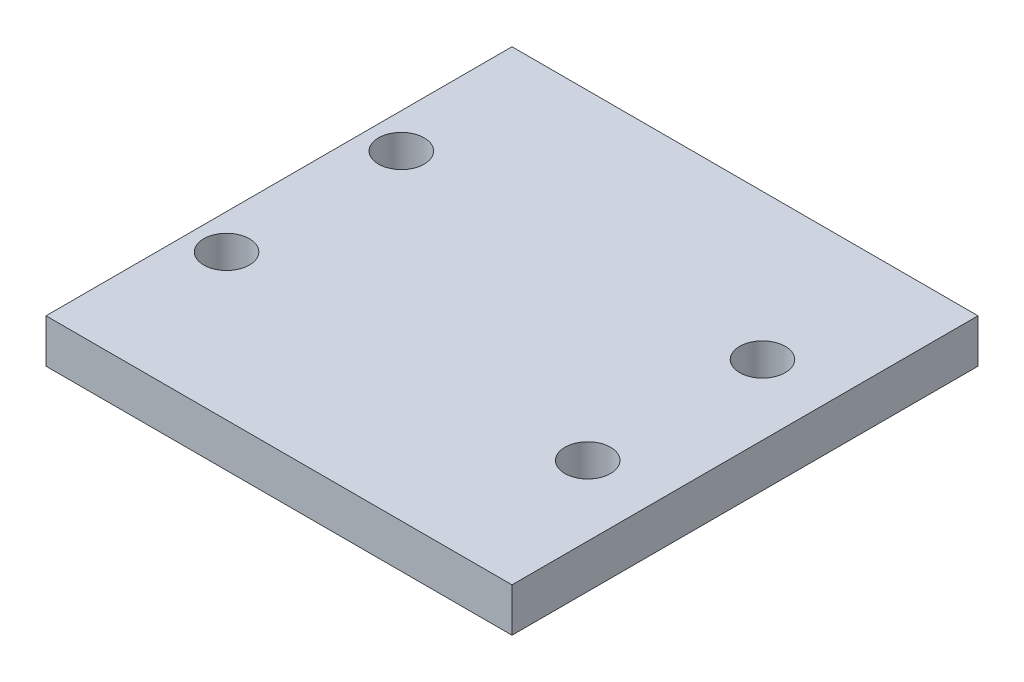
ISO-10303-21;
HEADER;
FILE_DESCRIPTION(('STEP AP214'),'2;1');
FILE_NAME('part.step','',(''),(''),'','','');
FILE_SCHEMA(('AUTOMOTIVE_DESIGN { 1 0 10303 214 1 1 1 1 }'));
ENDSEC;
DATA;
#1=APPLICATION_CONTEXT('core data for automotive mechanical design processes');
#2=APPLICATION_PROTOCOL_DEFINITION('international standard','automotive_design',2000,#1);
#3=PRODUCT_CONTEXT('',#1,'mechanical');
#4=PRODUCT('Part','Part','',(#3));
#5=PRODUCT_RELATED_PRODUCT_CATEGORY('part','',(#4));
#6=PRODUCT_DEFINITION_FORMATION('','',#4);
#7=PRODUCT_DEFINITION_CONTEXT('part definition',#1,'design');
#8=PRODUCT_DEFINITION('design','',#6,#7);
#9=PRODUCT_DEFINITION_SHAPE('','',#8);
#10=(LENGTH_UNIT() NAMED_UNIT(*) SI_UNIT(.MILLI.,.METRE.));
#11=(NAMED_UNIT(*) PLANE_ANGLE_UNIT() SI_UNIT($,.RADIAN.));
#12=(NAMED_UNIT(*) SI_UNIT($,.STERADIAN.) SOLID_ANGLE_UNIT());
#13=UNCERTAINTY_MEASURE_WITH_UNIT(LENGTH_MEASURE(1.E-05),#10,'distance_accuracy_value','');
#14=(GEOMETRIC_REPRESENTATION_CONTEXT(3) GLOBAL_UNCERTAINTY_ASSIGNED_CONTEXT((#13)) GLOBAL_UNIT_ASSIGNED_CONTEXT((#10,
#11,#12)) REPRESENTATION_CONTEXT('',''));
#15=CARTESIAN_POINT('',(0.,0.,0.));
#16=DIRECTION('',(0.,0.,1.));
#17=DIRECTION('',(1.,0.,0.));
#18=AXIS2_PLACEMENT_3D('',#15,#16,#17);
#19=CARTESIAN_POINT('',(0.,4.7625,0.));
#20=DIRECTION('',(1.,0.,0.));
#21=DIRECTION('',(0.,0.,-1.));
#22=AXIS2_PLACEMENT_3D('',#19,#20,#21);
#23=PLANE('',#22);
#24=DIRECTION('',(0.,0.,1.));
#25=VECTOR('',#24,1.);
#26=CARTESIAN_POINT('',(0.,0.,0.));
#27=LINE('',#26,#25);
#28=CARTESIAN_POINT('',(0.,0.,-50.8));
#29=VERTEX_POINT('',#28);
#30=CARTESIAN_POINT('',(0.,0.,0.));
#31=VERTEX_POINT('',#30);
#32=EDGE_CURVE('E107',#29,#31,#27,.T.);
#33=ORIENTED_EDGE('',*,*,#32,.T.);
#34=DIRECTION('',(0.,-1.,0.));
#35=VECTOR('',#34,1.);
#36=CARTESIAN_POINT('',(0.,4.7625,0.));
#37=LINE('',#36,#35);
#38=CARTESIAN_POINT('',(0.,4.7625,0.));
#39=VERTEX_POINT('',#38);
#40=EDGE_CURVE('E11',#39,#31,#37,.T.);
#41=ORIENTED_EDGE('',*,*,#40,.F.);
#42=DIRECTION('',(0.,0.,1.));
#43=VECTOR('',#42,1.);
#44=CARTESIAN_POINT('',(0.,4.7625,0.));
#45=LINE('',#44,#43);
#46=CARTESIAN_POINT('',(0.,4.7625,-50.8));
#47=VERTEX_POINT('',#46);
#48=EDGE_CURVE('E91',#47,#39,#45,.T.);
#49=ORIENTED_EDGE('',*,*,#48,.F.);
#50=DIRECTION('',(0.,-1.,0.));
#51=VECTOR('',#50,1.);
#52=CARTESIAN_POINT('',(0.,4.7625,-50.8));
#53=LINE('',#52,#51);
#54=EDGE_CURVE('E103',#47,#29,#53,.T.);
#55=ORIENTED_EDGE('',*,*,#54,.T.);
#56=EDGE_LOOP('',(#33,#41,#49,#55));
#57=FACE_BOUND('',#56,.T.);
#58=ADVANCED_FACE('F39',(#57),#23,.F.);
#59=CARTESIAN_POINT('',(0.,4.7625,0.));
#60=DIRECTION('',(0.,0.,-1.));
#61=DIRECTION('',(-1.,0.,0.));
#62=AXIS2_PLACEMENT_3D('',#59,#60,#61);
#63=PLANE('',#62);
#64=DIRECTION('',(1.,0.,0.));
#65=VECTOR('',#64,1.);
#66=CARTESIAN_POINT('',(0.,0.,0.));
#67=LINE('',#66,#65);
#68=CARTESIAN_POINT('',(50.8,0.,0.));
#69=VERTEX_POINT('',#68);
#70=EDGE_CURVE('E96',#31,#69,#67,.T.);
#71=ORIENTED_EDGE('',*,*,#70,.T.);
#72=DIRECTION('',(0.,-1.,0.));
#73=VECTOR('',#72,1.);
#74=CARTESIAN_POINT('',(50.8,4.7625,0.));
#75=LINE('',#74,#73);
#76=CARTESIAN_POINT('',(50.8,4.7625,0.));
#77=VERTEX_POINT('',#76);
#78=EDGE_CURVE('E48',#77,#69,#75,.T.);
#79=ORIENTED_EDGE('',*,*,#78,.F.);
#80=DIRECTION('',(1.,0.,0.));
#81=VECTOR('',#80,1.);
#82=CARTESIAN_POINT('',(0.,4.7625,0.));
#83=LINE('',#82,#81);
#84=EDGE_CURVE('E86',#39,#77,#83,.T.);
#85=ORIENTED_EDGE('',*,*,#84,.F.);
#86=ORIENTED_EDGE('',*,*,#40,.T.);
#87=EDGE_LOOP('',(#71,#79,#85,#86));
#88=FACE_BOUND('',#87,.T.);
#89=ADVANCED_FACE('F95',(#88),#63,.F.);
#90=CARTESIAN_POINT('',(50.8,4.7625,0.));
#91=DIRECTION('',(-1.,0.,0.));
#92=DIRECTION('',(0.,0.,1.));
#93=AXIS2_PLACEMENT_3D('',#90,#91,#92);
#94=PLANE('',#93);
#95=DIRECTION('',(0.,0.,-1.));
#96=VECTOR('',#95,1.);
#97=CARTESIAN_POINT('',(50.8,0.,0.));
#98=LINE('',#97,#96);
#99=CARTESIAN_POINT('',(50.8,0.,-50.8));
#100=VERTEX_POINT('',#99);
#101=EDGE_CURVE('E73',#69,#100,#98,.T.);
#102=ORIENTED_EDGE('',*,*,#101,.T.);
#103=DIRECTION('',(0.,-1.,0.));
#104=VECTOR('',#103,1.);
#105=CARTESIAN_POINT('',(50.8,4.7625,-50.8));
#106=LINE('',#105,#104);
#107=CARTESIAN_POINT('',(50.8,4.7625,-50.8));
#108=VERTEX_POINT('',#107);
#109=EDGE_CURVE('E98',#108,#100,#106,.T.);
#110=ORIENTED_EDGE('',*,*,#109,.F.);
#111=DIRECTION('',(0.,0.,-1.));
#112=VECTOR('',#111,1.);
#113=CARTESIAN_POINT('',(50.8,4.7625,0.));
#114=LINE('',#113,#112);
#115=EDGE_CURVE('E89',#77,#108,#114,.T.);
#116=ORIENTED_EDGE('',*,*,#115,.F.);
#117=ORIENTED_EDGE('',*,*,#78,.T.);
#118=EDGE_LOOP('',(#102,#110,#116,#117));
#119=FACE_BOUND('',#118,.T.);
#120=ADVANCED_FACE('F99',(#119),#94,.F.);
#121=CARTESIAN_POINT('',(0.,4.7625,-50.8));
#122=DIRECTION('',(0.,0.,1.));
#123=DIRECTION('',(1.,0.,0.));
#124=AXIS2_PLACEMENT_3D('',#121,#122,#123);
#125=PLANE('',#124);
#126=DIRECTION('',(-1.,0.,0.));
#127=VECTOR('',#126,1.);
#128=CARTESIAN_POINT('',(0.,0.,-50.8));
#129=LINE('',#128,#127);
#130=EDGE_CURVE('E79',#100,#29,#129,.T.);
#131=ORIENTED_EDGE('',*,*,#130,.T.);
#132=ORIENTED_EDGE('',*,*,#54,.F.);
#133=DIRECTION('',(-1.,0.,0.));
#134=VECTOR('',#133,1.);
#135=CARTESIAN_POINT('',(0.,4.7625,-50.8));
#136=LINE('',#135,#134);
#137=EDGE_CURVE('E56',#108,#47,#136,.T.);
#138=ORIENTED_EDGE('',*,*,#137,.F.);
#139=ORIENTED_EDGE('',*,*,#109,.T.);
#140=EDGE_LOOP('',(#131,#132,#138,#139));
#141=FACE_BOUND('',#140,.T.);
#142=ADVANCED_FACE('F121',(#141),#125,.F.);
#143=CARTESIAN_POINT('',(0.,4.7625,0.));
#144=DIRECTION('',(0.,-1.,0.));
#145=DIRECTION('',(0.,0.,-1.));
#146=AXIS2_PLACEMENT_3D('',#143,#144,#145);
#147=PLANE('',#146);
#148=CARTESIAN_POINT('',(3.81,4.7625,-34.925));
#149=DIRECTION('',(0.,1.,0.));
#150=DIRECTION('',(0.,0.,-1.));
#151=AXIS2_PLACEMENT_3D('',#148,#149,#150);
#152=CIRCLE('',#151,2.4892);
#153=CARTESIAN_POINT('',(3.81,4.7625,-32.4358));
#154=VERTEX_POINT('',#153);
#155=EDGE_CURVE('E136',#154,#154,#152,.T.);
#156=ORIENTED_EDGE('',*,*,#155,.F.);
#157=EDGE_LOOP('',(#156));
#158=FACE_BOUND('',#157,.T.);
#159=CARTESIAN_POINT('',(43.18,4.7625,-34.925));
#160=DIRECTION('',(0.,1.,0.));
#161=DIRECTION('',(0.,0.,1.));
#162=AXIS2_PLACEMENT_3D('',#159,#160,#161);
#163=CIRCLE('',#162,2.4892);
#164=CARTESIAN_POINT('',(43.18,4.7625,-32.4358));
#165=VERTEX_POINT('',#164);
#166=EDGE_CURVE('E144',#165,#165,#163,.T.);
#167=ORIENTED_EDGE('',*,*,#166,.F.);
#168=EDGE_LOOP('',(#167));
#169=FACE_BOUND('',#168,.T.);
#170=CARTESIAN_POINT('',(43.18,4.7625,-15.875));
#171=DIRECTION('',(0.,1.,0.));
#172=DIRECTION('',(0.,0.,-1.));
#173=AXIS2_PLACEMENT_3D('',#170,#171,#172);
#174=CIRCLE('',#173,2.4892);
#175=CARTESIAN_POINT('',(43.18,4.7625,-13.3858));
#176=VERTEX_POINT('',#175);
#177=EDGE_CURVE('E152',#176,#176,#174,.T.);
#178=ORIENTED_EDGE('',*,*,#177,.F.);
#179=EDGE_LOOP('',(#178));
#180=FACE_BOUND('',#179,.T.);
#181=CARTESIAN_POINT('',(3.81,4.7625,-15.875));
#182=DIRECTION('',(0.,1.,0.));
#183=DIRECTION('',(0.,0.,1.));
#184=AXIS2_PLACEMENT_3D('',#181,#182,#183);
#185=CIRCLE('',#184,2.4892);
#186=CARTESIAN_POINT('',(3.81,4.7625,-13.3858));
#187=VERTEX_POINT('',#186);
#188=EDGE_CURVE('E128',#187,#187,#185,.T.);
#189=ORIENTED_EDGE('',*,*,#188,.F.);
#190=EDGE_LOOP('',(#189));
#191=FACE_BOUND('',#190,.T.);
#192=ORIENTED_EDGE('',*,*,#48,.T.);
#193=ORIENTED_EDGE('',*,*,#84,.T.);
#194=ORIENTED_EDGE('',*,*,#115,.T.);
#195=ORIENTED_EDGE('',*,*,#137,.T.);
#196=EDGE_LOOP('',(#192,#193,#194,#195));
#197=FACE_BOUND('',#196,.T.);
#198=ADVANCED_FACE('F87',(#158,#169,#180,#191,#197),#147,.F.);
#199=CARTESIAN_POINT('',(0.,0.,0.));
#200=DIRECTION('',(0.,-1.,0.));
#201=DIRECTION('',(0.,0.,-1.));
#202=AXIS2_PLACEMENT_3D('',#199,#200,#201);
#203=PLANE('',#202);
#204=CARTESIAN_POINT('',(3.81,0.,-34.925));
#205=DIRECTION('',(0.,1.,0.));
#206=DIRECTION('',(0.,0.,-1.));
#207=AXIS2_PLACEMENT_3D('',#204,#205,#206);
#208=CIRCLE('',#207,2.4892);
#209=CARTESIAN_POINT('',(3.81,0.,-32.4358));
#210=VERTEX_POINT('',#209);
#211=EDGE_CURVE('E140',#210,#210,#208,.T.);
#212=ORIENTED_EDGE('',*,*,#211,.T.);
#213=EDGE_LOOP('',(#212));
#214=FACE_BOUND('',#213,.T.);
#215=CARTESIAN_POINT('',(43.18,0.,-34.925));
#216=DIRECTION('',(0.,1.,0.));
#217=DIRECTION('',(0.,0.,1.));
#218=AXIS2_PLACEMENT_3D('',#215,#216,#217);
#219=CIRCLE('',#218,2.4892);
#220=CARTESIAN_POINT('',(43.18,0.,-32.4358));
#221=VERTEX_POINT('',#220);
#222=EDGE_CURVE('E148',#221,#221,#219,.T.);
#223=ORIENTED_EDGE('',*,*,#222,.T.);
#224=EDGE_LOOP('',(#223));
#225=FACE_BOUND('',#224,.T.);
#226=CARTESIAN_POINT('',(43.18,0.,-15.875));
#227=DIRECTION('',(0.,1.,0.));
#228=DIRECTION('',(0.,0.,-1.));
#229=AXIS2_PLACEMENT_3D('',#226,#227,#228);
#230=CIRCLE('',#229,2.4892);
#231=CARTESIAN_POINT('',(43.18,0.,-13.3858));
#232=VERTEX_POINT('',#231);
#233=EDGE_CURVE('E132',#232,#232,#230,.T.);
#234=ORIENTED_EDGE('',*,*,#233,.T.);
#235=EDGE_LOOP('',(#234));
#236=FACE_BOUND('',#235,.T.);
#237=CARTESIAN_POINT('',(3.81,0.,-15.875));
#238=DIRECTION('',(0.,1.,0.));
#239=DIRECTION('',(0.,0.,1.));
#240=AXIS2_PLACEMENT_3D('',#237,#238,#239);
#241=CIRCLE('',#240,2.4892);
#242=CARTESIAN_POINT('',(3.81,0.,-13.3858));
#243=VERTEX_POINT('',#242);
#244=EDGE_CURVE('E111',#243,#243,#241,.T.);
#245=ORIENTED_EDGE('',*,*,#244,.T.);
#246=EDGE_LOOP('',(#245));
#247=FACE_BOUND('',#246,.T.);
#248=ORIENTED_EDGE('',*,*,#32,.F.);
#249=ORIENTED_EDGE('',*,*,#130,.F.);
#250=ORIENTED_EDGE('',*,*,#101,.F.);
#251=ORIENTED_EDGE('',*,*,#70,.F.);
#252=EDGE_LOOP('',(#248,#249,#250,#251));
#253=FACE_BOUND('',#252,.T.);
#254=ADVANCED_FACE('F124',(#214,#225,#236,#247,#253),#203,.T.);
#255=CARTESIAN_POINT('',(3.81,0.,-15.875));
#256=DIRECTION('',(0.,1.,0.));
#257=DIRECTION('',(0.,0.,1.));
#258=AXIS2_PLACEMENT_3D('',#255,#256,#257);
#259=CYLINDRICAL_SURFACE('',#258,2.4892);
#260=CARTESIAN_POINT('',(3.81,0.,-13.3858));
#261=CARTESIAN_POINT('',(3.81,0.049609375,-13.3858));
#262=CARTESIAN_POINT('',(3.81,0.09921875,-13.3858));
#263=CARTESIAN_POINT('',(3.81,0.1984375,-13.3858));
#264=CARTESIAN_POINT('',(3.81,0.248046875,-13.3858));
#265=CARTESIAN_POINT('',(3.81,0.347265625,-13.3858));
#266=CARTESIAN_POINT('',(3.81,0.396875,-13.3858));
#267=CARTESIAN_POINT('',(3.81,0.49609375,-13.3858));
#268=CARTESIAN_POINT('',(3.81,0.545703125,-13.3858));
#269=CARTESIAN_POINT('',(3.81,0.644921875,-13.3858));
#270=CARTESIAN_POINT('',(3.81,0.69453125,-13.3858));
#271=CARTESIAN_POINT('',(3.81,0.79375,-13.3858));
#272=CARTESIAN_POINT('',(3.81,0.843359375,-13.3858));
#273=CARTESIAN_POINT('',(3.81,0.942578125,-13.3858));
#274=CARTESIAN_POINT('',(3.81,0.9921875,-13.3858));
#275=CARTESIAN_POINT('',(3.81,1.09140625,-13.3858));
#276=CARTESIAN_POINT('',(3.81,1.141015625,-13.3858));
#277=CARTESIAN_POINT('',(3.81,1.240234375,-13.3858));
#278=CARTESIAN_POINT('',(3.81,1.28984375,-13.3858));
#279=CARTESIAN_POINT('',(3.81,1.3890625,-13.3858));
#280=CARTESIAN_POINT('',(3.81,1.438671875,-13.3858));
#281=CARTESIAN_POINT('',(3.81,1.537890625,-13.3858));
#282=CARTESIAN_POINT('',(3.81,1.5875,-13.3858));
#283=CARTESIAN_POINT('',(3.81,1.68671875,-13.3858));
#284=CARTESIAN_POINT('',(3.81,1.736328125,-13.3858));
#285=CARTESIAN_POINT('',(3.81,1.835546875,-13.3858));
#286=CARTESIAN_POINT('',(3.81,1.88515625,-13.3858));
#287=CARTESIAN_POINT('',(3.81,1.984375,-13.3858));
#288=CARTESIAN_POINT('',(3.81,2.033984375,-13.3858));
#289=CARTESIAN_POINT('',(3.81,2.133203125,-13.3858));
#290=CARTESIAN_POINT('',(3.81,2.1828125,-13.3858));
#291=CARTESIAN_POINT('',(3.81,2.28203125,-13.3858));
#292=CARTESIAN_POINT('',(3.81,2.331640625,-13.3858));
#293=CARTESIAN_POINT('',(3.81,2.430859375,-13.3858));
#294=CARTESIAN_POINT('',(3.81,2.48046875,-13.3858));
#295=CARTESIAN_POINT('',(3.81,2.5796875,-13.3858));
#296=CARTESIAN_POINT('',(3.81,2.629296875,-13.3858));
#297=CARTESIAN_POINT('',(3.81,2.728515625,-13.3858));
#298=CARTESIAN_POINT('',(3.81,2.778125,-13.3858));
#299=CARTESIAN_POINT('',(3.81,2.87734375,-13.3858));
#300=CARTESIAN_POINT('',(3.81,2.926953125,-13.3858));
#301=CARTESIAN_POINT('',(3.81,3.026171875,-13.3858));
#302=CARTESIAN_POINT('',(3.81,3.07578125,-13.3858));
#303=CARTESIAN_POINT('',(3.81,3.175,-13.3858));
#304=CARTESIAN_POINT('',(3.81,3.224609375,-13.3858));
#305=CARTESIAN_POINT('',(3.81,3.323828125,-13.3858));
#306=CARTESIAN_POINT('',(3.81,3.3734375,-13.3858));
#307=CARTESIAN_POINT('',(3.81,3.47265625,-13.3858));
#308=CARTESIAN_POINT('',(3.81,3.522265625,-13.3858));
#309=CARTESIAN_POINT('',(3.81,3.621484375,-13.3858));
#310=CARTESIAN_POINT('',(3.81,3.67109375,-13.3858));
#311=CARTESIAN_POINT('',(3.81,3.7703125,-13.3858));
#312=CARTESIAN_POINT('',(3.81,3.819921875,-13.3858));
#313=CARTESIAN_POINT('',(3.81,3.919140625,-13.3858));
#314=CARTESIAN_POINT('',(3.81,3.96875,-13.3858));
#315=CARTESIAN_POINT('',(3.81,4.06796875,-13.3858));
#316=CARTESIAN_POINT('',(3.81,4.117578125,-13.3858));
#317=CARTESIAN_POINT('',(3.81,4.216796875,-13.3858));
#318=CARTESIAN_POINT('',(3.81,4.26640625,-13.3858));
#319=CARTESIAN_POINT('',(3.81,4.365625,-13.3858));
#320=CARTESIAN_POINT('',(3.81,4.415234375,-13.3858));
#321=CARTESIAN_POINT('',(3.81,4.514453125,-13.3858));
#322=CARTESIAN_POINT('',(3.81,4.5640625,-13.3858));
#323=CARTESIAN_POINT('',(3.81,4.66328125,-13.3858));
#324=CARTESIAN_POINT('',(3.81,4.712890625,-13.3858));
#325=CARTESIAN_POINT('',(3.81,4.7625,-13.3858));
#326=B_SPLINE_CURVE_WITH_KNOTS('',3,(#260,#261,#262,#263,#264,#265,#266,#267,#268,#269,#270,
#271,#272,#273,#274,#275,#276,#277,#278,#279,#280,#281,#282,#283,#284,#285,#286,#287,#288,#289,
#290,#291,#292,#293,#294,#295,#296,#297,#298,#299,#300,#301,#302,#303,#304,#305,#306,#307,#308,
#309,#310,#311,#312,#313,#314,#315,#316,#317,#318,#319,#320,#321,#322,#323,#324,#325),
.UNSPECIFIED.,.F.,.F.,(4,2,2,2,2,2,2,2,2,2,2,2,2,2,2,2,2,2,2,2,2,2,2,2,2,2,2,2,2,2,2,2,4),(0.,
0.148828125,0.29765625,0.446484375,0.5953125,0.744140625,0.89296875,1.041796875,1.190625,
1.339453125,1.48828125,1.637109375,1.7859375,1.934765625,2.08359375,2.232421875,2.38125,
2.530078125,2.67890625,2.827734375,2.9765625,3.125390625,3.27421875,3.423046875,3.571875,
3.720703125,3.86953125,4.018359375,4.1671875,4.316015625,4.46484375,4.613671875,4.7625),.UNSPECIFIED.);
#327=EDGE_CURVE('BSEAM166',#243,#187,#326,.T.);
#328=ORIENTED_EDGE('',*,*,#244,.F.);
#329=ORIENTED_EDGE('',*,*,#188,.T.);
#330=ORIENTED_EDGE('',*,*,#327,.T.);
#331=ORIENTED_EDGE('',*,*,#327,.F.);
#332=EDGE_LOOP('',(#328,#330,#329,#331));
#333=FACE_BOUND('',#332,.T.);
#334=ADVANCED_FACE('F166',(#333),#259,.F.);
#335=CARTESIAN_POINT('',(43.18,0.,-15.875));
#336=DIRECTION('',(0.,1.,0.));
#337=DIRECTION('',(0.,0.,1.));
#338=AXIS2_PLACEMENT_3D('',#335,#336,#337);
#339=CYLINDRICAL_SURFACE('',#338,2.4892);
#340=CARTESIAN_POINT('',(43.18,0.,-13.3858));
#341=CARTESIAN_POINT('',(43.18,0.049609375,-13.3858));
#342=CARTESIAN_POINT('',(43.18,0.09921875,-13.3858));
#343=CARTESIAN_POINT('',(43.18,0.1984375,-13.3858));
#344=CARTESIAN_POINT('',(43.18,0.248046875,-13.3858));
#345=CARTESIAN_POINT('',(43.18,0.347265625,-13.3858));
#346=CARTESIAN_POINT('',(43.18,0.396875,-13.3858));
#347=CARTESIAN_POINT('',(43.18,0.49609375,-13.3858));
#348=CARTESIAN_POINT('',(43.18,0.545703125,-13.3858));
#349=CARTESIAN_POINT('',(43.18,0.644921875,-13.3858));
#350=CARTESIAN_POINT('',(43.18,0.69453125,-13.3858));
#351=CARTESIAN_POINT('',(43.18,0.79375,-13.3858));
#352=CARTESIAN_POINT('',(43.18,0.843359375,-13.3858));
#353=CARTESIAN_POINT('',(43.18,0.942578125,-13.3858));
#354=CARTESIAN_POINT('',(43.18,0.9921875,-13.3858));
#355=CARTESIAN_POINT('',(43.18,1.09140625,-13.3858));
#356=CARTESIAN_POINT('',(43.18,1.141015625,-13.3858));
#357=CARTESIAN_POINT('',(43.18,1.240234375,-13.3858));
#358=CARTESIAN_POINT('',(43.18,1.28984375,-13.3858));
#359=CARTESIAN_POINT('',(43.18,1.3890625,-13.3858));
#360=CARTESIAN_POINT('',(43.18,1.438671875,-13.3858));
#361=CARTESIAN_POINT('',(43.18,1.537890625,-13.3858));
#362=CARTESIAN_POINT('',(43.18,1.5875,-13.3858));
#363=CARTESIAN_POINT('',(43.18,1.68671875,-13.3858));
#364=CARTESIAN_POINT('',(43.18,1.736328125,-13.3858));
#365=CARTESIAN_POINT('',(43.18,1.835546875,-13.3858));
#366=CARTESIAN_POINT('',(43.18,1.88515625,-13.3858));
#367=CARTESIAN_POINT('',(43.18,1.984375,-13.3858));
#368=CARTESIAN_POINT('',(43.18,2.033984375,-13.3858));
#369=CARTESIAN_POINT('',(43.18,2.133203125,-13.3858));
#370=CARTESIAN_POINT('',(43.18,2.1828125,-13.3858));
#371=CARTESIAN_POINT('',(43.18,2.28203125,-13.3858));
#372=CARTESIAN_POINT('',(43.18,2.331640625,-13.3858));
#373=CARTESIAN_POINT('',(43.18,2.430859375,-13.3858));
#374=CARTESIAN_POINT('',(43.18,2.48046875,-13.3858));
#375=CARTESIAN_POINT('',(43.18,2.5796875,-13.3858));
#376=CARTESIAN_POINT('',(43.18,2.629296875,-13.3858));
#377=CARTESIAN_POINT('',(43.18,2.728515625,-13.3858));
#378=CARTESIAN_POINT('',(43.18,2.778125,-13.3858));
#379=CARTESIAN_POINT('',(43.18,2.87734375,-13.3858));
#380=CARTESIAN_POINT('',(43.18,2.926953125,-13.3858));
#381=CARTESIAN_POINT('',(43.18,3.026171875,-13.3858));
#382=CARTESIAN_POINT('',(43.18,3.07578125,-13.3858));
#383=CARTESIAN_POINT('',(43.18,3.175,-13.3858));
#384=CARTESIAN_POINT('',(43.18,3.224609375,-13.3858));
#385=CARTESIAN_POINT('',(43.18,3.323828125,-13.3858));
#386=CARTESIAN_POINT('',(43.18,3.3734375,-13.3858));
#387=CARTESIAN_POINT('',(43.18,3.47265625,-13.3858));
#388=CARTESIAN_POINT('',(43.18,3.522265625,-13.3858));
#389=CARTESIAN_POINT('',(43.18,3.621484375,-13.3858));
#390=CARTESIAN_POINT('',(43.18,3.67109375,-13.3858));
#391=CARTESIAN_POINT('',(43.18,3.7703125,-13.3858));
#392=CARTESIAN_POINT('',(43.18,3.819921875,-13.3858));
#393=CARTESIAN_POINT('',(43.18,3.919140625,-13.3858));
#394=CARTESIAN_POINT('',(43.18,3.96875,-13.3858));
#395=CARTESIAN_POINT('',(43.18,4.06796875,-13.3858));
#396=CARTESIAN_POINT('',(43.18,4.117578125,-13.3858));
#397=CARTESIAN_POINT('',(43.18,4.216796875,-13.3858));
#398=CARTESIAN_POINT('',(43.18,4.26640625,-13.3858));
#399=CARTESIAN_POINT('',(43.18,4.365625,-13.3858));
#400=CARTESIAN_POINT('',(43.18,4.415234375,-13.3858));
#401=CARTESIAN_POINT('',(43.18,4.514453125,-13.3858));
#402=CARTESIAN_POINT('',(43.18,4.5640625,-13.3858));
#403=CARTESIAN_POINT('',(43.18,4.66328125,-13.3858));
#404=CARTESIAN_POINT('',(43.18,4.712890625,-13.3858));
#405=CARTESIAN_POINT('',(43.18,4.7625,-13.3858));
#406=B_SPLINE_CURVE_WITH_KNOTS('',3,(#340,#341,#342,#343,#344,#345,#346,#347,#348,#349,#350,
#351,#352,#353,#354,#355,#356,#357,#358,#359,#360,#361,#362,#363,#364,#365,#366,#367,#368,#369,
#370,#371,#372,#373,#374,#375,#376,#377,#378,#379,#380,#381,#382,#383,#384,#385,#386,#387,#388,
#389,#390,#391,#392,#393,#394,#395,#396,#397,#398,#399,#400,#401,#402,#403,#404,#405),
.UNSPECIFIED.,.F.,.F.,(4,2,2,2,2,2,2,2,2,2,2,2,2,2,2,2,2,2,2,2,2,2,2,2,2,2,2,2,2,2,2,2,4),(0.,
0.148828125,0.29765625,0.446484375,0.5953125,0.744140625,0.89296875,1.041796875,1.190625,
1.339453125,1.48828125,1.637109375,1.7859375,1.934765625,2.08359375,2.232421875,2.38125,
2.530078125,2.67890625,2.827734375,2.9765625,3.125390625,3.27421875,3.423046875,3.571875,
3.720703125,3.86953125,4.018359375,4.1671875,4.316015625,4.46484375,4.613671875,4.7625),.UNSPECIFIED.);
#407=EDGE_CURVE('BSEAM162',#232,#176,#406,.T.);
#408=ORIENTED_EDGE('',*,*,#233,.F.);
#409=ORIENTED_EDGE('',*,*,#177,.T.);
#410=ORIENTED_EDGE('',*,*,#407,.T.);
#411=ORIENTED_EDGE('',*,*,#407,.F.);
#412=EDGE_LOOP('',(#408,#410,#409,#411));
#413=FACE_BOUND('',#412,.T.);
#414=ADVANCED_FACE('F162',(#413),#339,.F.);
#415=CARTESIAN_POINT('',(43.18,0.,-34.925));
#416=DIRECTION('',(0.,1.,0.));
#417=DIRECTION('',(0.,0.,1.));
#418=AXIS2_PLACEMENT_3D('',#415,#416,#417);
#419=CYLINDRICAL_SURFACE('',#418,2.4892);
#420=CARTESIAN_POINT('',(43.18,0.,-32.4358));
#421=CARTESIAN_POINT('',(43.18,0.049609375,-32.4358));
#422=CARTESIAN_POINT('',(43.18,0.09921875,-32.4358));
#423=CARTESIAN_POINT('',(43.18,0.1984375,-32.4358));
#424=CARTESIAN_POINT('',(43.18,0.248046875,-32.4358));
#425=CARTESIAN_POINT('',(43.18,0.347265625,-32.4358));
#426=CARTESIAN_POINT('',(43.18,0.396875,-32.4358));
#427=CARTESIAN_POINT('',(43.18,0.49609375,-32.4358));
#428=CARTESIAN_POINT('',(43.18,0.545703125,-32.4358));
#429=CARTESIAN_POINT('',(43.18,0.644921875,-32.4358));
#430=CARTESIAN_POINT('',(43.18,0.69453125,-32.4358));
#431=CARTESIAN_POINT('',(43.18,0.79375,-32.4358));
#432=CARTESIAN_POINT('',(43.18,0.843359375,-32.4358));
#433=CARTESIAN_POINT('',(43.18,0.942578125,-32.4358));
#434=CARTESIAN_POINT('',(43.18,0.9921875,-32.4358));
#435=CARTESIAN_POINT('',(43.18,1.09140625,-32.4358));
#436=CARTESIAN_POINT('',(43.18,1.141015625,-32.4358));
#437=CARTESIAN_POINT('',(43.18,1.240234375,-32.4358));
#438=CARTESIAN_POINT('',(43.18,1.28984375,-32.4358));
#439=CARTESIAN_POINT('',(43.18,1.3890625,-32.4358));
#440=CARTESIAN_POINT('',(43.18,1.438671875,-32.4358));
#441=CARTESIAN_POINT('',(43.18,1.537890625,-32.4358));
#442=CARTESIAN_POINT('',(43.18,1.5875,-32.4358));
#443=CARTESIAN_POINT('',(43.18,1.68671875,-32.4358));
#444=CARTESIAN_POINT('',(43.18,1.736328125,-32.4358));
#445=CARTESIAN_POINT('',(43.18,1.835546875,-32.4358));
#446=CARTESIAN_POINT('',(43.18,1.88515625,-32.4358));
#447=CARTESIAN_POINT('',(43.18,1.984375,-32.4358));
#448=CARTESIAN_POINT('',(43.18,2.033984375,-32.4358));
#449=CARTESIAN_POINT('',(43.18,2.133203125,-32.4358));
#450=CARTESIAN_POINT('',(43.18,2.1828125,-32.4358));
#451=CARTESIAN_POINT('',(43.18,2.28203125,-32.4358));
#452=CARTESIAN_POINT('',(43.18,2.331640625,-32.4358));
#453=CARTESIAN_POINT('',(43.18,2.430859375,-32.4358));
#454=CARTESIAN_POINT('',(43.18,2.48046875,-32.4358));
#455=CARTESIAN_POINT('',(43.18,2.5796875,-32.4358));
#456=CARTESIAN_POINT('',(43.18,2.629296875,-32.4358));
#457=CARTESIAN_POINT('',(43.18,2.728515625,-32.4358));
#458=CARTESIAN_POINT('',(43.18,2.778125,-32.4358));
#459=CARTESIAN_POINT('',(43.18,2.87734375,-32.4358));
#460=CARTESIAN_POINT('',(43.18,2.926953125,-32.4358));
#461=CARTESIAN_POINT('',(43.18,3.026171875,-32.4358));
#462=CARTESIAN_POINT('',(43.18,3.07578125,-32.4358));
#463=CARTESIAN_POINT('',(43.18,3.175,-32.4358));
#464=CARTESIAN_POINT('',(43.18,3.224609375,-32.4358));
#465=CARTESIAN_POINT('',(43.18,3.323828125,-32.4358));
#466=CARTESIAN_POINT('',(43.18,3.3734375,-32.4358));
#467=CARTESIAN_POINT('',(43.18,3.47265625,-32.4358));
#468=CARTESIAN_POINT('',(43.18,3.522265625,-32.4358));
#469=CARTESIAN_POINT('',(43.18,3.621484375,-32.4358));
#470=CARTESIAN_POINT('',(43.18,3.67109375,-32.4358));
#471=CARTESIAN_POINT('',(43.18,3.7703125,-32.4358));
#472=CARTESIAN_POINT('',(43.18,3.819921875,-32.4358));
#473=CARTESIAN_POINT('',(43.18,3.919140625,-32.4358));
#474=CARTESIAN_POINT('',(43.18,3.96875,-32.4358));
#475=CARTESIAN_POINT('',(43.18,4.06796875,-32.4358));
#476=CARTESIAN_POINT('',(43.18,4.117578125,-32.4358));
#477=CARTESIAN_POINT('',(43.18,4.216796875,-32.4358));
#478=CARTESIAN_POINT('',(43.18,4.26640625,-32.4358));
#479=CARTESIAN_POINT('',(43.18,4.365625,-32.4358));
#480=CARTESIAN_POINT('',(43.18,4.415234375,-32.4358));
#481=CARTESIAN_POINT('',(43.18,4.514453125,-32.4358));
#482=CARTESIAN_POINT('',(43.18,4.5640625,-32.4358));
#483=CARTESIAN_POINT('',(43.18,4.66328125,-32.4358));
#484=CARTESIAN_POINT('',(43.18,4.712890625,-32.4358));
#485=CARTESIAN_POINT('',(43.18,4.7625,-32.4358));
#486=B_SPLINE_CURVE_WITH_KNOTS('',3,(#420,#421,#422,#423,#424,#425,#426,#427,#428,#429,#430,
#431,#432,#433,#434,#435,#436,#437,#438,#439,#440,#441,#442,#443,#444,#445,#446,#447,#448,#449,
#450,#451,#452,#453,#454,#455,#456,#457,#458,#459,#460,#461,#462,#463,#464,#465,#466,#467,#468,
#469,#470,#471,#472,#473,#474,#475,#476,#477,#478,#479,#480,#481,#482,#483,#484,#485),
.UNSPECIFIED.,.F.,.F.,(4,2,2,2,2,2,2,2,2,2,2,2,2,2,2,2,2,2,2,2,2,2,2,2,2,2,2,2,2,2,2,2,4),(0.,
0.148828125,0.29765625,0.446484375,0.5953125,0.744140625,0.89296875,1.041796875,1.190625,
1.339453125,1.48828125,1.637109375,1.7859375,1.934765625,2.08359375,2.232421875,2.38125,
2.530078125,2.67890625,2.827734375,2.9765625,3.125390625,3.27421875,3.423046875,3.571875,
3.720703125,3.86953125,4.018359375,4.1671875,4.316015625,4.46484375,4.613671875,4.7625),.UNSPECIFIED.);
#487=EDGE_CURVE('BSEAM165',#221,#165,#486,.T.);
#488=ORIENTED_EDGE('',*,*,#222,.F.);
#489=ORIENTED_EDGE('',*,*,#166,.T.);
#490=ORIENTED_EDGE('',*,*,#487,.T.);
#491=ORIENTED_EDGE('',*,*,#487,.F.);
#492=EDGE_LOOP('',(#488,#490,#489,#491));
#493=FACE_BOUND('',#492,.T.);
#494=ADVANCED_FACE('F165',(#493),#419,.F.);
#495=CARTESIAN_POINT('',(3.81,0.,-34.925));
#496=DIRECTION('',(0.,1.,0.));
#497=DIRECTION('',(0.,0.,1.));
#498=AXIS2_PLACEMENT_3D('',#495,#496,#497);
#499=CYLINDRICAL_SURFACE('',#498,2.4892);
#500=CARTESIAN_POINT('',(3.81,0.,-32.4358));
#501=CARTESIAN_POINT('',(3.81,0.049609375,-32.4358));
#502=CARTESIAN_POINT('',(3.81,0.09921875,-32.4358));
#503=CARTESIAN_POINT('',(3.81,0.1984375,-32.4358));
#504=CARTESIAN_POINT('',(3.81,0.248046875,-32.4358));
#505=CARTESIAN_POINT('',(3.81,0.347265625,-32.4358));
#506=CARTESIAN_POINT('',(3.81,0.396875,-32.4358));
#507=CARTESIAN_POINT('',(3.81,0.49609375,-32.4358));
#508=CARTESIAN_POINT('',(3.81,0.545703125,-32.4358));
#509=CARTESIAN_POINT('',(3.81,0.644921875,-32.4358));
#510=CARTESIAN_POINT('',(3.81,0.69453125,-32.4358));
#511=CARTESIAN_POINT('',(3.81,0.79375,-32.4358));
#512=CARTESIAN_POINT('',(3.81,0.843359375,-32.4358));
#513=CARTESIAN_POINT('',(3.81,0.942578125,-32.4358));
#514=CARTESIAN_POINT('',(3.81,0.9921875,-32.4358));
#515=CARTESIAN_POINT('',(3.81,1.09140625,-32.4358));
#516=CARTESIAN_POINT('',(3.81,1.141015625,-32.4358));
#517=CARTESIAN_POINT('',(3.81,1.240234375,-32.4358));
#518=CARTESIAN_POINT('',(3.81,1.28984375,-32.4358));
#519=CARTESIAN_POINT('',(3.81,1.3890625,-32.4358));
#520=CARTESIAN_POINT('',(3.81,1.438671875,-32.4358));
#521=CARTESIAN_POINT('',(3.81,1.537890625,-32.4358));
#522=CARTESIAN_POINT('',(3.81,1.5875,-32.4358));
#523=CARTESIAN_POINT('',(3.81,1.68671875,-32.4358));
#524=CARTESIAN_POINT('',(3.81,1.736328125,-32.4358));
#525=CARTESIAN_POINT('',(3.81,1.835546875,-32.4358));
#526=CARTESIAN_POINT('',(3.81,1.88515625,-32.4358));
#527=CARTESIAN_POINT('',(3.81,1.984375,-32.4358));
#528=CARTESIAN_POINT('',(3.81,2.033984375,-32.4358));
#529=CARTESIAN_POINT('',(3.81,2.133203125,-32.4358));
#530=CARTESIAN_POINT('',(3.81,2.1828125,-32.4358));
#531=CARTESIAN_POINT('',(3.81,2.28203125,-32.4358));
#532=CARTESIAN_POINT('',(3.81,2.331640625,-32.4358));
#533=CARTESIAN_POINT('',(3.81,2.430859375,-32.4358));
#534=CARTESIAN_POINT('',(3.81,2.48046875,-32.4358));
#535=CARTESIAN_POINT('',(3.81,2.5796875,-32.4358));
#536=CARTESIAN_POINT('',(3.81,2.629296875,-32.4358));
#537=CARTESIAN_POINT('',(3.81,2.728515625,-32.4358));
#538=CARTESIAN_POINT('',(3.81,2.778125,-32.4358));
#539=CARTESIAN_POINT('',(3.81,2.87734375,-32.4358));
#540=CARTESIAN_POINT('',(3.81,2.926953125,-32.4358));
#541=CARTESIAN_POINT('',(3.81,3.026171875,-32.4358));
#542=CARTESIAN_POINT('',(3.81,3.07578125,-32.4358));
#543=CARTESIAN_POINT('',(3.81,3.175,-32.4358));
#544=CARTESIAN_POINT('',(3.81,3.224609375,-32.4358));
#545=CARTESIAN_POINT('',(3.81,3.323828125,-32.4358));
#546=CARTESIAN_POINT('',(3.81,3.3734375,-32.4358));
#547=CARTESIAN_POINT('',(3.81,3.47265625,-32.4358));
#548=CARTESIAN_POINT('',(3.81,3.522265625,-32.4358));
#549=CARTESIAN_POINT('',(3.81,3.621484375,-32.4358));
#550=CARTESIAN_POINT('',(3.81,3.67109375,-32.4358));
#551=CARTESIAN_POINT('',(3.81,3.7703125,-32.4358));
#552=CARTESIAN_POINT('',(3.81,3.819921875,-32.4358));
#553=CARTESIAN_POINT('',(3.81,3.919140625,-32.4358));
#554=CARTESIAN_POINT('',(3.81,3.96875,-32.4358));
#555=CARTESIAN_POINT('',(3.81,4.06796875,-32.4358));
#556=CARTESIAN_POINT('',(3.81,4.117578125,-32.4358));
#557=CARTESIAN_POINT('',(3.81,4.216796875,-32.4358));
#558=CARTESIAN_POINT('',(3.81,4.26640625,-32.4358));
#559=CARTESIAN_POINT('',(3.81,4.365625,-32.4358));
#560=CARTESIAN_POINT('',(3.81,4.415234375,-32.4358));
#561=CARTESIAN_POINT('',(3.81,4.514453125,-32.4358));
#562=CARTESIAN_POINT('',(3.81,4.5640625,-32.4358));
#563=CARTESIAN_POINT('',(3.81,4.66328125,-32.4358));
#564=CARTESIAN_POINT('',(3.81,4.712890625,-32.4358));
#565=CARTESIAN_POINT('',(3.81,4.7625,-32.4358));
#566=B_SPLINE_CURVE_WITH_KNOTS('',3,(#500,#501,#502,#503,#504,#505,#506,#507,#508,#509,#510,
#511,#512,#513,#514,#515,#516,#517,#518,#519,#520,#521,#522,#523,#524,#525,#526,#527,#528,#529,
#530,#531,#532,#533,#534,#535,#536,#537,#538,#539,#540,#541,#542,#543,#544,#545,#546,#547,#548,
#549,#550,#551,#552,#553,#554,#555,#556,#557,#558,#559,#560,#561,#562,#563,#564,#565),
.UNSPECIFIED.,.F.,.F.,(4,2,2,2,2,2,2,2,2,2,2,2,2,2,2,2,2,2,2,2,2,2,2,2,2,2,2,2,2,2,2,2,4),(0.,
0.148828125,0.29765625,0.446484375,0.5953125,0.744140625,0.89296875,1.041796875,1.190625,
1.339453125,1.48828125,1.637109375,1.7859375,1.934765625,2.08359375,2.232421875,2.38125,
2.530078125,2.67890625,2.827734375,2.9765625,3.125390625,3.27421875,3.423046875,3.571875,
3.720703125,3.86953125,4.018359375,4.1671875,4.316015625,4.46484375,4.613671875,4.7625),.UNSPECIFIED.);
#567=EDGE_CURVE('BSEAM227',#210,#154,#566,.T.);
#568=ORIENTED_EDGE('',*,*,#211,.F.);
#569=ORIENTED_EDGE('',*,*,#155,.T.);
#570=ORIENTED_EDGE('',*,*,#567,.T.);
#571=ORIENTED_EDGE('',*,*,#567,.F.);
#572=EDGE_LOOP('',(#568,#570,#569,#571));
#573=FACE_BOUND('',#572,.T.);
#574=ADVANCED_FACE('F227',(#573),#499,.F.);
#575=CLOSED_SHELL('',(#58,#89,#120,#142,#198,#254,#334,#414,#494,#574));
#576=MANIFOLD_SOLID_BREP('B2',#575);
#577=ADVANCED_BREP_SHAPE_REPRESENTATION('',(#18,#576),#14);
#578=SHAPE_DEFINITION_REPRESENTATION(#9,#577);
ENDSEC;
END-ISO-10303-21;
